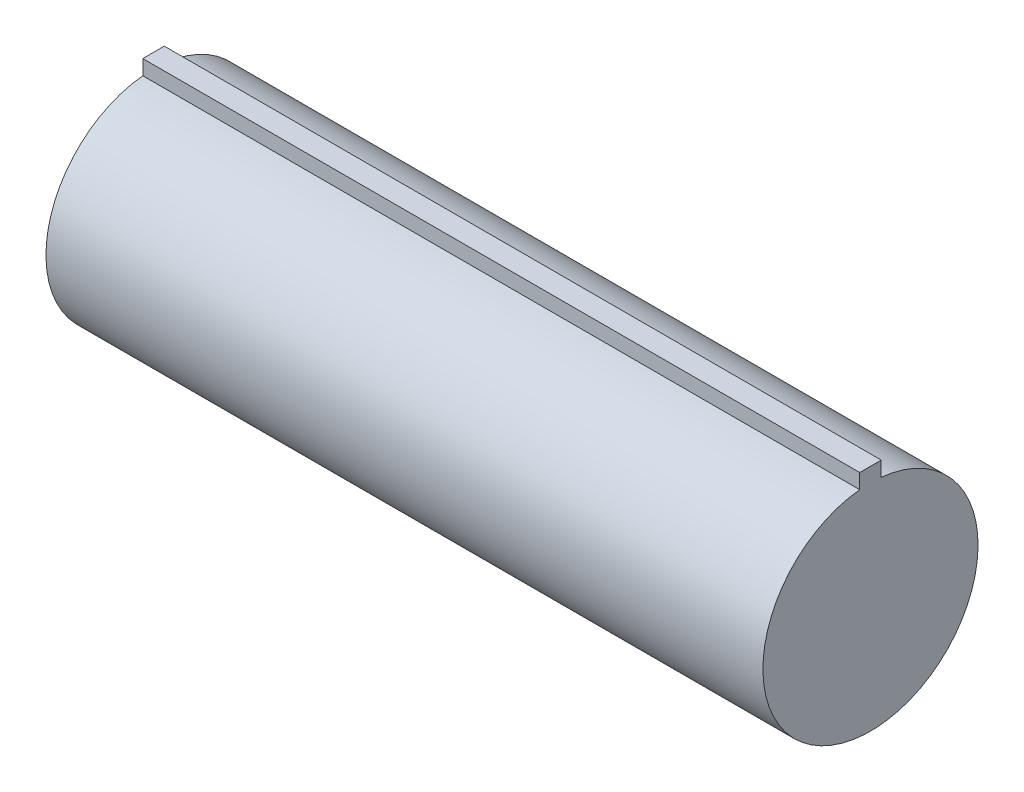
ISO-10303-21;
HEADER;
FILE_DESCRIPTION(('STEP AP214'),'2;1');
FILE_NAME('part.step','',(''),(''),'','','');
FILE_SCHEMA(('AUTOMOTIVE_DESIGN { 1 0 10303 214 1 1 1 1 }'));
ENDSEC;
DATA;
#1=APPLICATION_CONTEXT('core data for automotive mechanical design processes');
#2=APPLICATION_PROTOCOL_DEFINITION('international standard','automotive_design',2000,#1);
#3=PRODUCT_CONTEXT('',#1,'mechanical');
#4=PRODUCT('Part','Part','',(#3));
#5=PRODUCT_RELATED_PRODUCT_CATEGORY('part','',(#4));
#6=PRODUCT_DEFINITION_FORMATION('','',#4);
#7=PRODUCT_DEFINITION_CONTEXT('part definition',#1,'design');
#8=PRODUCT_DEFINITION('design','',#6,#7);
#9=PRODUCT_DEFINITION_SHAPE('','',#8);
#10=(LENGTH_UNIT() NAMED_UNIT(*) SI_UNIT(.MILLI.,.METRE.));
#11=(NAMED_UNIT(*) PLANE_ANGLE_UNIT() SI_UNIT($,.RADIAN.));
#12=(NAMED_UNIT(*) SI_UNIT($,.STERADIAN.) SOLID_ANGLE_UNIT());
#13=UNCERTAINTY_MEASURE_WITH_UNIT(LENGTH_MEASURE(1.E-05),#10,'distance_accuracy_value','');
#14=(GEOMETRIC_REPRESENTATION_CONTEXT(3) GLOBAL_UNCERTAINTY_ASSIGNED_CONTEXT((#13)) GLOBAL_UNIT_ASSIGNED_CONTEXT((#10,
#11,#12)) REPRESENTATION_CONTEXT('',''));
#15=CARTESIAN_POINT('',(0.,0.,0.));
#16=DIRECTION('',(0.,0.,1.));
#17=DIRECTION('',(1.,0.,0.));
#18=AXIS2_PLACEMENT_3D('',#15,#16,#17);
#19=CARTESIAN_POINT('',(100.,0.,0.));
#20=DIRECTION('',(-1.,0.,0.));
#21=DIRECTION('',(0.,0.,1.));
#22=AXIS2_PLACEMENT_3D('',#19,#20,#21);
#23=CYLINDRICAL_SURFACE('',#22,15.);
#24=CARTESIAN_POINT('',(0.,0.,0.));
#25=DIRECTION('',(1.,0.,0.));
#26=DIRECTION('',(0.,0.,-1.));
#27=AXIS2_PLACEMENT_3D('',#24,#25,#26);
#28=CIRCLE('',#27,15.);
#29=CARTESIAN_POINT('',(0.,14.9248115565993,1.5));
#30=VERTEX_POINT('',#29);
#31=CARTESIAN_POINT('',(0.,14.9248115565993,-1.5));
#32=VERTEX_POINT('',#31);
#33=EDGE_CURVE('E154',#30,#32,#28,.T.);
#34=ORIENTED_EDGE('',*,*,#33,.T.);
#35=DIRECTION('',(-1.,0.,0.));
#36=VECTOR('',#35,1.);
#37=CARTESIAN_POINT('',(100.,14.9248115565993,-1.5));
#38=LINE('',#37,#36);
#39=CARTESIAN_POINT('',(100.,14.9248115565993,-1.5));
#40=VERTEX_POINT('',#39);
#41=EDGE_CURVE('E11',#40,#32,#38,.T.);
#42=ORIENTED_EDGE('',*,*,#41,.F.);
#43=CARTESIAN_POINT('',(100.,0.,0.));
#44=DIRECTION('',(1.,0.,0.));
#45=DIRECTION('',(0.,0.,-1.));
#46=AXIS2_PLACEMENT_3D('',#43,#44,#45);
#47=CIRCLE('',#46,15.);
#48=CARTESIAN_POINT('',(100.,14.9248115565993,1.5));
#49=VERTEX_POINT('',#48);
#50=EDGE_CURVE('E158',#49,#40,#47,.T.);
#51=ORIENTED_EDGE('',*,*,#50,.F.);
#52=DIRECTION('',(-1.,0.,0.));
#53=VECTOR('',#52,1.);
#54=CARTESIAN_POINT('',(100.,14.9248115565993,1.5));
#55=LINE('',#54,#53);
#56=EDGE_CURVE('E70',#49,#30,#55,.T.);
#57=ORIENTED_EDGE('',*,*,#56,.T.);
#58=EDGE_LOOP('',(#34,#42,#51,#57));
#59=FACE_BOUND('',#58,.T.);
#60=ADVANCED_FACE('F47',(#59),#23,.T.);
#61=CARTESIAN_POINT('',(100.,0.,-1.5));
#62=DIRECTION('',(0.,0.,1.));
#63=DIRECTION('',(0.,-1.,0.));
#64=AXIS2_PLACEMENT_3D('',#61,#62,#63);
#65=PLANE('',#64);
#66=DIRECTION('',(0.,1.,0.));
#67=VECTOR('',#66,1.);
#68=CARTESIAN_POINT('',(0.,0.,-1.5));
#69=LINE('',#68,#67);
#70=CARTESIAN_POINT('',(0.,17.,-1.5));
#71=VERTEX_POINT('',#70);
#72=EDGE_CURVE('E168',#32,#71,#69,.T.);
#73=ORIENTED_EDGE('',*,*,#72,.T.);
#74=DIRECTION('',(-1.,0.,0.));
#75=VECTOR('',#74,1.);
#76=CARTESIAN_POINT('',(100.,17.,-1.5));
#77=LINE('',#76,#75);
#78=CARTESIAN_POINT('',(100.,17.,-1.5));
#79=VERTEX_POINT('',#78);
#80=EDGE_CURVE('E54',#79,#71,#77,.T.);
#81=ORIENTED_EDGE('',*,*,#80,.F.);
#82=DIRECTION('',(0.,1.,0.));
#83=VECTOR('',#82,1.);
#84=CARTESIAN_POINT('',(100.,0.,-1.5));
#85=LINE('',#84,#83);
#86=EDGE_CURVE('E96',#40,#79,#85,.T.);
#87=ORIENTED_EDGE('',*,*,#86,.F.);
#88=ORIENTED_EDGE('',*,*,#41,.T.);
#89=EDGE_LOOP('',(#73,#81,#87,#88));
#90=FACE_BOUND('',#89,.T.);
#91=ADVANCED_FACE('F182',(#90),#65,.F.);
#92=CARTESIAN_POINT('',(100.,17.,0.));
#93=DIRECTION('',(0.,1.,0.));
#94=DIRECTION('',(0.,0.,1.));
#95=AXIS2_PLACEMENT_3D('',#92,#93,#94);
#96=PLANE('',#95);
#97=DIRECTION('',(0.,0.,-1.));
#98=VECTOR('',#97,1.);
#99=CARTESIAN_POINT('',(0.,17.,0.));
#100=LINE('',#99,#98);
#101=CARTESIAN_POINT('',(0.,17.,1.5));
#102=VERTEX_POINT('',#101);
#103=EDGE_CURVE('E171',#102,#71,#100,.T.);
#104=ORIENTED_EDGE('',*,*,#103,.F.);
#105=DIRECTION('',(-1.,0.,0.));
#106=VECTOR('',#105,1.);
#107=CARTESIAN_POINT('',(100.,17.,1.5));
#108=LINE('',#107,#106);
#109=CARTESIAN_POINT('',(100.,17.,1.5));
#110=VERTEX_POINT('',#109);
#111=EDGE_CURVE('E177',#110,#102,#108,.T.);
#112=ORIENTED_EDGE('',*,*,#111,.F.);
#113=DIRECTION('',(0.,0.,-1.));
#114=VECTOR('',#113,1.);
#115=CARTESIAN_POINT('',(100.,17.,0.));
#116=LINE('',#115,#114);
#117=EDGE_CURVE('E162',#110,#79,#116,.T.);
#118=ORIENTED_EDGE('',*,*,#117,.T.);
#119=ORIENTED_EDGE('',*,*,#80,.T.);
#120=EDGE_LOOP('',(#104,#112,#118,#119));
#121=FACE_BOUND('',#120,.T.);
#122=ADVANCED_FACE('F180',(#121),#96,.T.);
#123=CARTESIAN_POINT('',(100.,0.,1.5));
#124=DIRECTION('',(0.,0.,1.));
#125=DIRECTION('',(1.,0.,0.));
#126=AXIS2_PLACEMENT_3D('',#123,#124,#125);
#127=PLANE('',#126);
#128=DIRECTION('',(0.,1.,0.));
#129=VECTOR('',#128,1.);
#130=CARTESIAN_POINT('',(0.,0.,1.5));
#131=LINE('',#130,#129);
#132=EDGE_CURVE('E160',#30,#102,#131,.T.);
#133=ORIENTED_EDGE('',*,*,#132,.F.);
#134=ORIENTED_EDGE('',*,*,#56,.F.);
#135=DIRECTION('',(0.,1.,0.));
#136=VECTOR('',#135,1.);
#137=CARTESIAN_POINT('',(100.,0.,1.5));
#138=LINE('',#137,#136);
#139=EDGE_CURVE('E165',#49,#110,#138,.T.);
#140=ORIENTED_EDGE('',*,*,#139,.T.);
#141=ORIENTED_EDGE('',*,*,#111,.T.);
#142=EDGE_LOOP('',(#133,#134,#140,#141));
#143=FACE_BOUND('',#142,.T.);
#144=ADVANCED_FACE('F186',(#143),#127,.T.);
#145=CARTESIAN_POINT('',(100.,0.,0.));
#146=DIRECTION('',(1.,0.,0.));
#147=DIRECTION('',(0.,0.,-1.));
#148=AXIS2_PLACEMENT_3D('',#145,#146,#147);
#149=PLANE('',#148);
#150=ORIENTED_EDGE('',*,*,#50,.T.);
#151=ORIENTED_EDGE('',*,*,#86,.T.);
#152=ORIENTED_EDGE('',*,*,#117,.F.);
#153=ORIENTED_EDGE('',*,*,#139,.F.);
#154=EDGE_LOOP('',(#150,#151,#152,#153));
#155=FACE_BOUND('',#154,.T.);
#156=ADVANCED_FACE('F189',(#155),#149,.T.);
#157=CARTESIAN_POINT('',(0.,0.,0.));
#158=DIRECTION('',(1.,0.,0.));
#159=DIRECTION('',(0.,0.,-1.));
#160=AXIS2_PLACEMENT_3D('',#157,#158,#159);
#161=PLANE('',#160);
#162=DIRECTION('',(0.,0.,-1.));
#163=VECTOR('',#162,1.);
#164=CARTESIAN_POINT('',(0.,3.,-3.));
#165=LINE('',#164,#163);
#166=CARTESIAN_POINT('',(0.,3.,3.));
#167=VERTEX_POINT('',#166);
#168=CARTESIAN_POINT('',(0.,3.,-3.));
#169=VERTEX_POINT('',#168);
#170=EDGE_CURVE('E148',#167,#169,#165,.T.);
#171=ORIENTED_EDGE('',*,*,#170,.F.);
#172=DIRECTION('',(0.,1.,0.));
#173=VECTOR('',#172,1.);
#174=CARTESIAN_POINT('',(0.,-3.,3.));
#175=LINE('',#174,#173);
#176=CARTESIAN_POINT('',(0.,-3.,3.));
#177=VERTEX_POINT('',#176);
#178=EDGE_CURVE('E61',#177,#167,#175,.T.);
#179=ORIENTED_EDGE('',*,*,#178,.F.);
#180=DIRECTION('',(0.,0.,1.));
#181=VECTOR('',#180,1.);
#182=CARTESIAN_POINT('',(0.,-3.,-3.));
#183=LINE('',#182,#181);
#184=CARTESIAN_POINT('',(0.,-3.,-3.));
#185=VERTEX_POINT('',#184);
#186=EDGE_CURVE('E139',#185,#177,#183,.T.);
#187=ORIENTED_EDGE('',*,*,#186,.F.);
#188=DIRECTION('',(0.,-1.,0.));
#189=VECTOR('',#188,1.);
#190=CARTESIAN_POINT('',(0.,-3.,-3.));
#191=LINE('',#190,#189);
#192=EDGE_CURVE('E142',#169,#185,#191,.T.);
#193=ORIENTED_EDGE('',*,*,#192,.F.);
#194=EDGE_LOOP('',(#171,#179,#187,#193));
#195=FACE_BOUND('',#194,.T.);
#196=ORIENTED_EDGE('',*,*,#33,.F.);
#197=ORIENTED_EDGE('',*,*,#132,.T.);
#198=ORIENTED_EDGE('',*,*,#103,.T.);
#199=ORIENTED_EDGE('',*,*,#72,.F.);
#200=EDGE_LOOP('',(#196,#197,#198,#199));
#201=FACE_BOUND('',#200,.T.);
#202=ADVANCED_FACE('F185',(#195,#201),#161,.F.);
#203=CARTESIAN_POINT('',(15.,-3.,3.));
#204=DIRECTION('',(0.,0.,1.));
#205=DIRECTION('',(1.,0.,0.));
#206=AXIS2_PLACEMENT_3D('',#203,#204,#205);
#207=PLANE('',#206);
#208=ORIENTED_EDGE('',*,*,#178,.T.);
#209=DIRECTION('',(-1.,0.,0.));
#210=VECTOR('',#209,1.);
#211=CARTESIAN_POINT('',(15.,3.,3.));
#212=LINE('',#211,#210);
#213=CARTESIAN_POINT('',(15.,3.,3.));
#214=VERTEX_POINT('',#213);
#215=EDGE_CURVE('E117',#214,#167,#212,.T.);
#216=ORIENTED_EDGE('',*,*,#215,.F.);
#217=DIRECTION('',(0.,1.,0.));
#218=VECTOR('',#217,1.);
#219=CARTESIAN_POINT('',(15.,-3.,3.));
#220=LINE('',#219,#218);
#221=CARTESIAN_POINT('',(15.,-3.,3.));
#222=VERTEX_POINT('',#221);
#223=EDGE_CURVE('E121',#222,#214,#220,.T.);
#224=ORIENTED_EDGE('',*,*,#223,.F.);
#225=DIRECTION('',(-1.,0.,0.));
#226=VECTOR('',#225,1.);
#227=CARTESIAN_POINT('',(15.,-3.,3.));
#228=LINE('',#227,#226);
#229=EDGE_CURVE('E152',#222,#177,#228,.T.);
#230=ORIENTED_EDGE('',*,*,#229,.T.);
#231=EDGE_LOOP('',(#208,#216,#224,#230));
#232=FACE_BOUND('',#231,.T.);
#233=ADVANCED_FACE('F119',(#232),#207,.F.);
#234=CARTESIAN_POINT('',(15.,-3.,-3.));
#235=DIRECTION('',(0.,-1.,0.));
#236=DIRECTION('',(0.,0.,-1.));
#237=AXIS2_PLACEMENT_3D('',#234,#235,#236);
#238=PLANE('',#237);
#239=ORIENTED_EDGE('',*,*,#186,.T.);
#240=ORIENTED_EDGE('',*,*,#229,.F.);
#241=DIRECTION('',(0.,0.,1.));
#242=VECTOR('',#241,1.);
#243=CARTESIAN_POINT('',(15.,-3.,-3.));
#244=LINE('',#243,#242);
#245=CARTESIAN_POINT('',(15.,-3.,-3.));
#246=VERTEX_POINT('',#245);
#247=EDGE_CURVE('E127',#246,#222,#244,.T.);
#248=ORIENTED_EDGE('',*,*,#247,.F.);
#249=DIRECTION('',(-1.,0.,0.));
#250=VECTOR('',#249,1.);
#251=CARTESIAN_POINT('',(15.,-3.,-3.));
#252=LINE('',#251,#250);
#253=EDGE_CURVE('E155',#246,#185,#252,.T.);
#254=ORIENTED_EDGE('',*,*,#253,.T.);
#255=EDGE_LOOP('',(#239,#240,#248,#254));
#256=FACE_BOUND('',#255,.T.);
#257=ADVANCED_FACE('F208',(#256),#238,.F.);
#258=CARTESIAN_POINT('',(15.,-3.,-3.));
#259=DIRECTION('',(0.,0.,-1.));
#260=DIRECTION('',(-1.,0.,0.));
#261=AXIS2_PLACEMENT_3D('',#258,#259,#260);
#262=PLANE('',#261);
#263=ORIENTED_EDGE('',*,*,#192,.T.);
#264=ORIENTED_EDGE('',*,*,#253,.F.);
#265=DIRECTION('',(0.,-1.,0.));
#266=VECTOR('',#265,1.);
#267=CARTESIAN_POINT('',(15.,-3.,-3.));
#268=LINE('',#267,#266);
#269=CARTESIAN_POINT('',(15.,3.,-3.));
#270=VERTEX_POINT('',#269);
#271=EDGE_CURVE('E135',#270,#246,#268,.T.);
#272=ORIENTED_EDGE('',*,*,#271,.F.);
#273=DIRECTION('',(-1.,0.,0.));
#274=VECTOR('',#273,1.);
#275=CARTESIAN_POINT('',(15.,3.,-3.));
#276=LINE('',#275,#274);
#277=EDGE_CURVE('E126',#270,#169,#276,.T.);
#278=ORIENTED_EDGE('',*,*,#277,.T.);
#279=EDGE_LOOP('',(#263,#264,#272,#278));
#280=FACE_BOUND('',#279,.T.);
#281=ADVANCED_FACE('F211',(#280),#262,.F.);
#282=CARTESIAN_POINT('',(15.,3.,-3.));
#283=DIRECTION('',(0.,1.,0.));
#284=DIRECTION('',(0.,0.,1.));
#285=AXIS2_PLACEMENT_3D('',#282,#283,#284);
#286=PLANE('',#285);
#287=ORIENTED_EDGE('',*,*,#170,.T.);
#288=ORIENTED_EDGE('',*,*,#277,.F.);
#289=DIRECTION('',(0.,0.,-1.));
#290=VECTOR('',#289,1.);
#291=CARTESIAN_POINT('',(15.,3.,-3.));
#292=LINE('',#291,#290);
#293=EDGE_CURVE('E130',#214,#270,#292,.T.);
#294=ORIENTED_EDGE('',*,*,#293,.F.);
#295=ORIENTED_EDGE('',*,*,#215,.T.);
#296=EDGE_LOOP('',(#287,#288,#294,#295));
#297=FACE_BOUND('',#296,.T.);
#298=ADVANCED_FACE('F131',(#297),#286,.F.);
#299=CARTESIAN_POINT('',(15.,0.,0.));
#300=DIRECTION('',(1.,0.,0.));
#301=DIRECTION('',(0.,0.,-1.));
#302=AXIS2_PLACEMENT_3D('',#299,#300,#301);
#303=PLANE('',#302);
#304=ORIENTED_EDGE('',*,*,#223,.T.);
#305=ORIENTED_EDGE('',*,*,#293,.T.);
#306=ORIENTED_EDGE('',*,*,#271,.T.);
#307=ORIENTED_EDGE('',*,*,#247,.T.);
#308=EDGE_LOOP('',(#304,#305,#306,#307));
#309=FACE_BOUND('',#308,.T.);
#310=ADVANCED_FACE('F137',(#309),#303,.F.);
#311=CLOSED_SHELL('',(#60,#91,#122,#144,#156,#202,#233,#257,#281,#298,#310));
#312=MANIFOLD_SOLID_BREP('B2',#311);
#313=ADVANCED_BREP_SHAPE_REPRESENTATION('',(#18,#312),#14);
#314=SHAPE_DEFINITION_REPRESENTATION(#9,#313);
ENDSEC;
END-ISO-10303-21;
